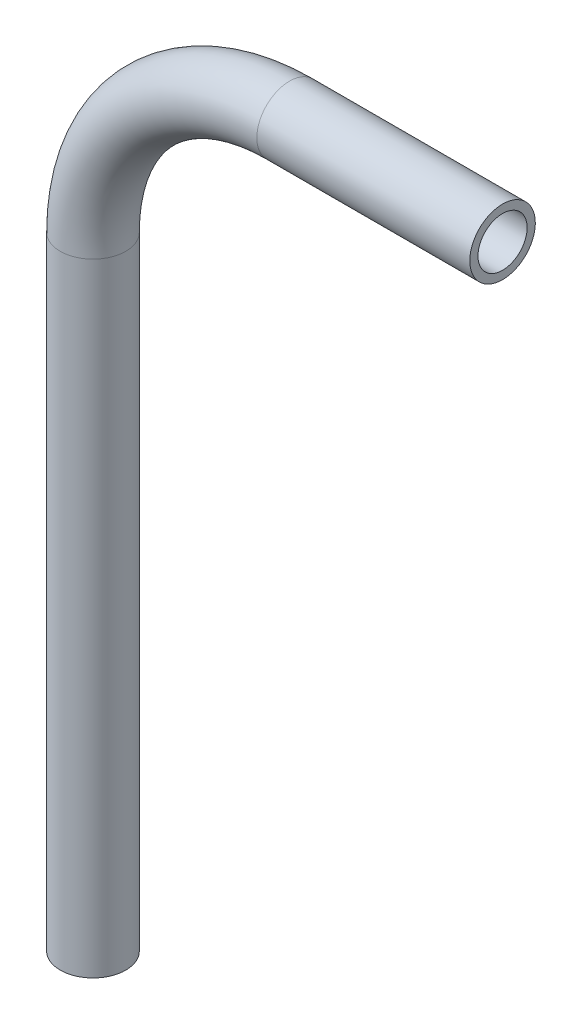
ISO-10303-21;
HEADER;
FILE_DESCRIPTION(('STEP AP214'),'2;1');
FILE_NAME('part.step','',(''),(''),'','','');
FILE_SCHEMA(('AUTOMOTIVE_DESIGN { 1 0 10303 214 1 1 1 1 }'));
ENDSEC;
DATA;
#1=APPLICATION_CONTEXT('core data for automotive mechanical design processes');
#2=APPLICATION_PROTOCOL_DEFINITION('international standard','automotive_design',2000,#1);
#3=PRODUCT_CONTEXT('',#1,'mechanical');
#4=PRODUCT('Part','Part','',(#3));
#5=PRODUCT_RELATED_PRODUCT_CATEGORY('part','',(#4));
#6=PRODUCT_DEFINITION_FORMATION('','',#4);
#7=PRODUCT_DEFINITION_CONTEXT('part definition',#1,'design');
#8=PRODUCT_DEFINITION('design','',#6,#7);
#9=PRODUCT_DEFINITION_SHAPE('','',#8);
#10=(LENGTH_UNIT() NAMED_UNIT(*) SI_UNIT(.MILLI.,.METRE.));
#11=(NAMED_UNIT(*) PLANE_ANGLE_UNIT() SI_UNIT($,.RADIAN.));
#12=(NAMED_UNIT(*) SI_UNIT($,.STERADIAN.) SOLID_ANGLE_UNIT());
#13=UNCERTAINTY_MEASURE_WITH_UNIT(LENGTH_MEASURE(1.E-05),#10,'distance_accuracy_value','');
#14=(GEOMETRIC_REPRESENTATION_CONTEXT(3) GLOBAL_UNCERTAINTY_ASSIGNED_CONTEXT((#13)) GLOBAL_UNIT_ASSIGNED_CONTEXT((#10,
#11,#12)) REPRESENTATION_CONTEXT('',''));
#15=CARTESIAN_POINT('',(0.,0.,0.));
#16=DIRECTION('',(0.,0.,1.));
#17=DIRECTION('',(1.,0.,0.));
#18=AXIS2_PLACEMENT_3D('',#15,#16,#17);
#19=CARTESIAN_POINT('',(0.,0.,0.));
#20=DIRECTION('',(0.,1.,0.));
#21=DIRECTION('',(0.,0.,1.));
#22=AXIS2_PLACEMENT_3D('',#19,#20,#21);
#23=CYLINDRICAL_SURFACE('',#22,4.);
#24=CARTESIAN_POINT('',(0.,76.,0.));
#25=DIRECTION('',(0.,1.,0.));
#26=DIRECTION('',(0.,0.,1.));
#27=AXIS2_PLACEMENT_3D('',#24,#25,#26);
#28=CIRCLE('',#27,4.);
#29=CARTESIAN_POINT('',(-4.00000000000001,76.,0.));
#30=VERTEX_POINT('',#29);
#31=EDGE_CURVE('E78',#30,#30,#28,.T.);
#32=ORIENTED_EDGE('',*,*,#31,.F.);
#33=EDGE_LOOP('',(#32));
#34=FACE_BOUND('',#33,.T.);
#35=CARTESIAN_POINT('',(0.,0.,0.));
#36=DIRECTION('',(0.,1.,0.));
#37=DIRECTION('',(0.,0.,1.));
#38=AXIS2_PLACEMENT_3D('',#35,#36,#37);
#39=CIRCLE('',#38,4.);
#40=CARTESIAN_POINT('',(0.,0.,4.));
#41=VERTEX_POINT('',#40);
#42=EDGE_CURVE('E47',#41,#41,#39,.T.);
#43=ORIENTED_EDGE('',*,*,#42,.T.);
#44=EDGE_LOOP('',(#43));
#45=FACE_BOUND('',#44,.T.);
#46=ADVANCED_FACE('F32',(#34,#45),#23,.T.);
#47=CARTESIAN_POINT('',(24.,76.,0.));
#48=DIRECTION('',(0.,0.,-1.));
#49=DIRECTION('',(-1.,0.,0.));
#50=AXIS2_PLACEMENT_3D('',#47,#48,#49);
#51=TOROIDAL_SURFACE('',#50,24.,4.);
#52=CARTESIAN_POINT('',(24.,100.,0.));
#53=DIRECTION('',(1.,0.,0.));
#54=DIRECTION('',(0.,0.,1.));
#55=AXIS2_PLACEMENT_3D('',#52,#53,#54);
#56=CIRCLE('',#55,4.);
#57=CARTESIAN_POINT('',(24.,104.,0.));
#58=VERTEX_POINT('',#57);
#59=EDGE_CURVE('E36',#58,#58,#56,.T.);
#60=CARTESIAN_POINT('',(24.,76.,0.));
#61=DIRECTION('',(0.,0.,-1.));
#62=DIRECTION('',(-1.,0.,0.));
#63=AXIS2_PLACEMENT_3D('',#60,#61,#62);
#64=CIRCLE('',#63,28.);
#65=EDGE_CURVE('',#30,#58,#64,.T.);
#66=ORIENTED_EDGE('',*,*,#31,.T.);
#67=ORIENTED_EDGE('',*,*,#59,.F.);
#68=ORIENTED_EDGE('',*,*,#65,.T.);
#69=ORIENTED_EDGE('',*,*,#65,.F.);
#70=EDGE_LOOP('',(#66,#68,#67,#69));
#71=FACE_BOUND('',#70,.T.);
#72=ADVANCED_FACE('F86',(#71),#51,.T.);
#73=CARTESIAN_POINT('',(24.,100.,0.));
#74=DIRECTION('',(1.,0.,0.));
#75=DIRECTION('',(0.,0.,-1.));
#76=AXIS2_PLACEMENT_3D('',#73,#74,#75);
#77=CYLINDRICAL_SURFACE('',#76,4.);
#78=CARTESIAN_POINT('',(50.,100.,0.));
#79=DIRECTION('',(1.,0.,0.));
#80=DIRECTION('',(0.,0.,1.));
#81=AXIS2_PLACEMENT_3D('',#78,#79,#80);
#82=CIRCLE('',#81,4.);
#83=CARTESIAN_POINT('',(50.,100.,4.));
#84=VERTEX_POINT('',#83);
#85=EDGE_CURVE('E52',#84,#84,#82,.T.);
#86=ORIENTED_EDGE('',*,*,#85,.F.);
#87=EDGE_LOOP('',(#86));
#88=FACE_BOUND('',#87,.T.);
#89=ORIENTED_EDGE('',*,*,#59,.T.);
#90=EDGE_LOOP('',(#89));
#91=FACE_BOUND('',#90,.T.);
#92=ADVANCED_FACE('F34',(#88,#91),#77,.T.);
#93=CARTESIAN_POINT('',(0.,0.,0.));
#94=DIRECTION('',(0.,1.,0.));
#95=DIRECTION('',(0.,0.,1.));
#96=AXIS2_PLACEMENT_3D('',#93,#94,#95);
#97=PLANE('',#96);
#98=CARTESIAN_POINT('',(0.,0.,0.));
#99=DIRECTION('',(0.,1.,0.));
#100=DIRECTION('',(0.,0.,1.));
#101=AXIS2_PLACEMENT_3D('',#98,#99,#100);
#102=CIRCLE('',#101,3.);
#103=CARTESIAN_POINT('',(0.,0.,3.));
#104=VERTEX_POINT('',#103);
#105=EDGE_CURVE('E73',#104,#104,#102,.F.);
#106=ORIENTED_EDGE('',*,*,#105,.F.);
#107=EDGE_LOOP('',(#106));
#108=FACE_BOUND('',#107,.T.);
#109=ORIENTED_EDGE('',*,*,#42,.F.);
#110=EDGE_LOOP('',(#109));
#111=FACE_BOUND('',#110,.T.);
#112=ADVANCED_FACE('F92',(#108,#111),#97,.F.);
#113=CARTESIAN_POINT('',(50.,100.,0.));
#114=DIRECTION('',(1.,0.,0.));
#115=DIRECTION('',(0.,0.,1.));
#116=AXIS2_PLACEMENT_3D('',#113,#114,#115);
#117=PLANE('',#116);
#118=CARTESIAN_POINT('',(50.,100.,0.));
#119=DIRECTION('',(1.,0.,0.));
#120=DIRECTION('',(0.,0.,1.));
#121=AXIS2_PLACEMENT_3D('',#118,#119,#120);
#122=CIRCLE('',#121,3.);
#123=CARTESIAN_POINT('',(50.,100.,3.));
#124=VERTEX_POINT('',#123);
#125=EDGE_CURVE('E11',#124,#124,#122,.F.);
#126=ORIENTED_EDGE('',*,*,#125,.T.);
#127=EDGE_LOOP('',(#126));
#128=FACE_BOUND('',#127,.T.);
#129=ORIENTED_EDGE('',*,*,#85,.T.);
#130=EDGE_LOOP('',(#129));
#131=FACE_BOUND('',#130,.T.);
#132=ADVANCED_FACE('F59',(#128,#131),#117,.T.);
#133=CARTESIAN_POINT('',(0.,0.,0.));
#134=DIRECTION('',(0.,1.,0.));
#135=DIRECTION('',(0.,0.,1.));
#136=AXIS2_PLACEMENT_3D('',#133,#134,#135);
#137=CYLINDRICAL_SURFACE('',#136,3.);
#138=CARTESIAN_POINT('',(0.,76.,0.));
#139=DIRECTION('',(0.,1.,0.));
#140=DIRECTION('',(0.,0.,1.));
#141=AXIS2_PLACEMENT_3D('',#138,#139,#140);
#142=CIRCLE('',#141,3.);
#143=CARTESIAN_POINT('',(-3.00000000000001,76.,0.));
#144=VERTEX_POINT('',#143);
#145=EDGE_CURVE('E70',#144,#144,#142,.F.);
#146=ORIENTED_EDGE('',*,*,#145,.F.);
#147=EDGE_LOOP('',(#146));
#148=FACE_BOUND('',#147,.T.);
#149=ORIENTED_EDGE('',*,*,#105,.T.);
#150=EDGE_LOOP('',(#149));
#151=FACE_BOUND('',#150,.T.);
#152=ADVANCED_FACE('F100',(#148,#151),#137,.F.);
#153=CARTESIAN_POINT('',(24.,76.,0.));
#154=DIRECTION('',(0.,0.,-1.));
#155=DIRECTION('',(-1.,0.,0.));
#156=AXIS2_PLACEMENT_3D('',#153,#154,#155);
#157=TOROIDAL_SURFACE('',#156,24.,3.);
#158=CARTESIAN_POINT('',(24.,100.,0.));
#159=DIRECTION('',(1.,0.,0.));
#160=DIRECTION('',(0.,0.,1.));
#161=AXIS2_PLACEMENT_3D('',#158,#159,#160);
#162=CIRCLE('',#161,3.);
#163=CARTESIAN_POINT('',(24.,103.,0.));
#164=VERTEX_POINT('',#163);
#165=EDGE_CURVE('E41',#164,#164,#162,.F.);
#166=CARTESIAN_POINT('',(24.,76.,0.));
#167=DIRECTION('',(0.,0.,-1.));
#168=DIRECTION('',(-1.,0.,0.));
#169=AXIS2_PLACEMENT_3D('',#166,#167,#168);
#170=CIRCLE('',#169,27.);
#171=EDGE_CURVE('',#144,#164,#170,.T.);
#172=ORIENTED_EDGE('',*,*,#145,.T.);
#173=ORIENTED_EDGE('',*,*,#165,.F.);
#174=ORIENTED_EDGE('',*,*,#171,.T.);
#175=ORIENTED_EDGE('',*,*,#171,.F.);
#176=EDGE_LOOP('',(#172,#174,#173,#175));
#177=FACE_BOUND('',#176,.T.);
#178=ADVANCED_FACE('F65',(#177),#157,.F.);
#179=CARTESIAN_POINT('',(24.,100.,0.));
#180=DIRECTION('',(1.,0.,0.));
#181=DIRECTION('',(0.,0.,-1.));
#182=AXIS2_PLACEMENT_3D('',#179,#180,#181);
#183=CYLINDRICAL_SURFACE('',#182,3.);
#184=ORIENTED_EDGE('',*,*,#125,.F.);
#185=EDGE_LOOP('',(#184));
#186=FACE_BOUND('',#185,.T.);
#187=ORIENTED_EDGE('',*,*,#165,.T.);
#188=EDGE_LOOP('',(#187));
#189=FACE_BOUND('',#188,.T.);
#190=ADVANCED_FACE('F62',(#186,#189),#183,.F.);
#191=CLOSED_SHELL('',(#46,#72,#92,#112,#132,#152,#178,#190));
#192=MANIFOLD_SOLID_BREP('B2',#191);
#193=ADVANCED_BREP_SHAPE_REPRESENTATION('',(#18,#192),#14);
#194=SHAPE_DEFINITION_REPRESENTATION(#9,#193);
ENDSEC;
END-ISO-10303-21;
